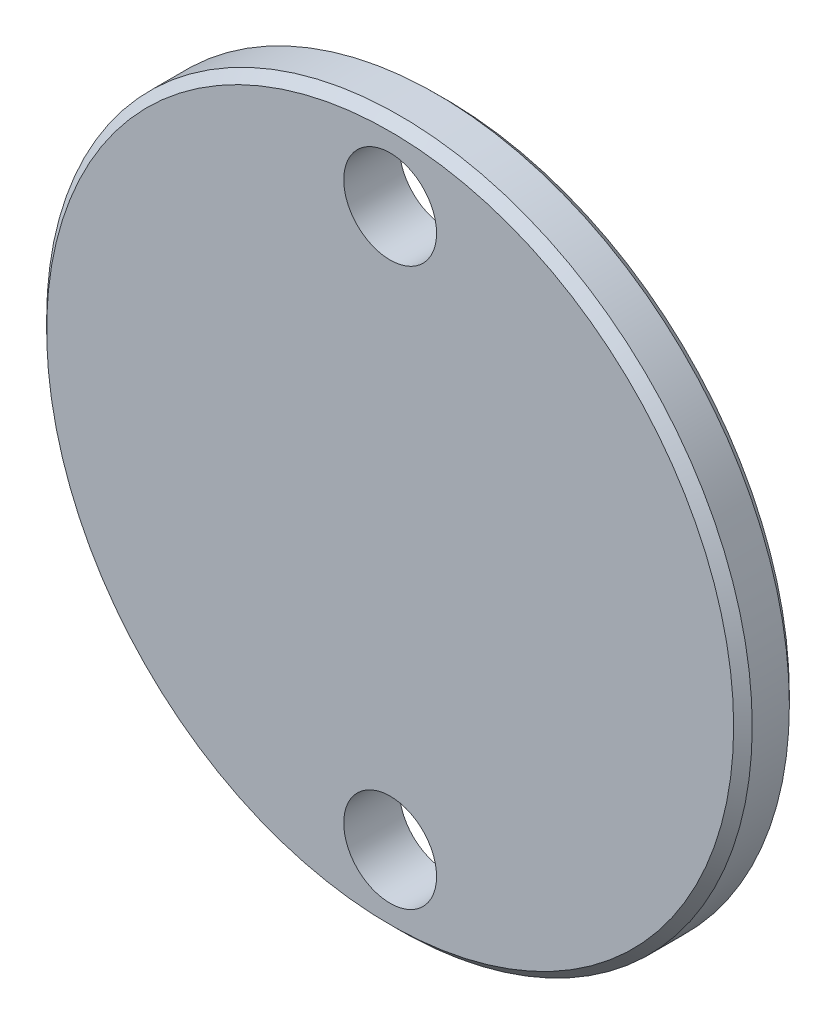
ISO-10303-21;
HEADER;
FILE_DESCRIPTION(('STEP AP214'),'2;1');
FILE_NAME('part.step','',(''),(''),'','','');
FILE_SCHEMA(('AUTOMOTIVE_DESIGN { 1 0 10303 214 1 1 1 1 }'));
ENDSEC;
DATA;
#1=APPLICATION_CONTEXT('core data for automotive mechanical design processes');
#2=APPLICATION_PROTOCOL_DEFINITION('international standard','automotive_design',2000,#1);
#3=PRODUCT_CONTEXT('',#1,'mechanical');
#4=PRODUCT('Part','Part','',(#3));
#5=PRODUCT_RELATED_PRODUCT_CATEGORY('part','',(#4));
#6=PRODUCT_DEFINITION_FORMATION('','',#4);
#7=PRODUCT_DEFINITION_CONTEXT('part definition',#1,'design');
#8=PRODUCT_DEFINITION('design','',#6,#7);
#9=PRODUCT_DEFINITION_SHAPE('','',#8);
#10=(LENGTH_UNIT() NAMED_UNIT(*) SI_UNIT(.MILLI.,.METRE.));
#11=(NAMED_UNIT(*) PLANE_ANGLE_UNIT() SI_UNIT($,.RADIAN.));
#12=(NAMED_UNIT(*) SI_UNIT($,.STERADIAN.) SOLID_ANGLE_UNIT());
#13=UNCERTAINTY_MEASURE_WITH_UNIT(LENGTH_MEASURE(1.E-05),#10,'distance_accuracy_value','');
#14=(GEOMETRIC_REPRESENTATION_CONTEXT(3) GLOBAL_UNCERTAINTY_ASSIGNED_CONTEXT((#13)) GLOBAL_UNIT_ASSIGNED_CONTEXT((#10,
#11,#12)) REPRESENTATION_CONTEXT('',''));
#15=CARTESIAN_POINT('',(0.,0.,0.));
#16=DIRECTION('',(0.,0.,1.));
#17=DIRECTION('',(1.,0.,0.));
#18=AXIS2_PLACEMENT_3D('',#15,#16,#17);
#19=CARTESIAN_POINT('',(0.,0.,3.));
#20=DIRECTION('',(0.,0.,-1.));
#21=DIRECTION('',(-1.,0.,0.));
#22=AXIS2_PLACEMENT_3D('',#19,#20,#21);
#23=CYLINDRICAL_SURFACE('',#22,19.);
#24=CARTESIAN_POINT('',(0.,0.,0.499999999999997));
#25=DIRECTION('',(0.,0.,1.));
#26=DIRECTION('',(1.,0.,0.));
#27=AXIS2_PLACEMENT_3D('',#24,#25,#26);
#28=CIRCLE('',#27,19.);
#29=CARTESIAN_POINT('',(19.,0.,0.499999999999997));
#30=VERTEX_POINT('',#29);
#31=EDGE_CURVE('E39',#30,#30,#28,.T.);
#32=ORIENTED_EDGE('',*,*,#31,.T.);
#33=EDGE_LOOP('',(#32));
#34=FACE_BOUND('',#33,.T.);
#35=CARTESIAN_POINT('',(0.,0.,2.49999999999999));
#36=DIRECTION('',(0.,0.,1.));
#37=DIRECTION('',(1.,0.,0.));
#38=AXIS2_PLACEMENT_3D('',#35,#36,#37);
#39=CIRCLE('',#38,19.);
#40=CARTESIAN_POINT('',(19.,0.,2.49999999999999));
#41=VERTEX_POINT('',#40);
#42=EDGE_CURVE('E43',#41,#41,#39,.F.);
#43=ORIENTED_EDGE('',*,*,#42,.T.);
#44=EDGE_LOOP('',(#43));
#45=FACE_BOUND('',#44,.T.);
#46=ADVANCED_FACE('F28',(#34,#45),#23,.T.);
#47=CARTESIAN_POINT('',(0.,0.,3.));
#48=DIRECTION('',(0.,0.,1.));
#49=DIRECTION('',(1.,0.,0.));
#50=AXIS2_PLACEMENT_3D('',#47,#48,#49);
#51=PLANE('',#50);
#52=CARTESIAN_POINT('',(0.,0.,3.));
#53=DIRECTION('',(0.,0.,1.));
#54=DIRECTION('',(1.,0.,0.));
#55=AXIS2_PLACEMENT_3D('',#52,#53,#54);
#56=CIRCLE('',#55,18.5);
#57=CARTESIAN_POINT('',(18.5,0.,3.));
#58=VERTEX_POINT('',#57);
#59=EDGE_CURVE('E10',#58,#58,#56,.T.);
#60=ORIENTED_EDGE('',*,*,#59,.T.);
#61=EDGE_LOOP('',(#60));
#62=FACE_BOUND('',#61,.T.);
#63=CARTESIAN_POINT('',(4.22651822394593E-13,-15.,3.));
#64=DIRECTION('',(0.,0.,1.));
#65=DIRECTION('',(1.,0.,0.));
#66=AXIS2_PLACEMENT_3D('',#63,#64,#65);
#67=CIRCLE('',#66,2.5000000000005);
#68=CARTESIAN_POINT('',(2.50000000000093,-15.,3.));
#69=VERTEX_POINT('',#68);
#70=EDGE_CURVE('E53',#69,#69,#67,.T.);
#71=ORIENTED_EDGE('',*,*,#70,.F.);
#72=EDGE_LOOP('',(#71));
#73=FACE_BOUND('',#72,.T.);
#74=CARTESIAN_POINT('',(0.,15.,3.));
#75=DIRECTION('',(0.,0.,1.));
#76=DIRECTION('',(1.,0.,0.));
#77=AXIS2_PLACEMENT_3D('',#74,#75,#76);
#78=CIRCLE('',#77,2.5);
#79=CARTESIAN_POINT('',(2.5,15.,3.));
#80=VERTEX_POINT('',#79);
#81=EDGE_CURVE('E52',#80,#80,#78,.T.);
#82=ORIENTED_EDGE('',*,*,#81,.F.);
#83=EDGE_LOOP('',(#82));
#84=FACE_BOUND('',#83,.T.);
#85=ADVANCED_FACE('F64',(#62,#73,#84),#51,.T.);
#86=CARTESIAN_POINT('',(0.,0.,0.));
#87=DIRECTION('',(0.,0.,1.));
#88=DIRECTION('',(1.,0.,0.));
#89=AXIS2_PLACEMENT_3D('',#86,#87,#88);
#90=PLANE('',#89);
#91=CARTESIAN_POINT('',(0.,0.,0.));
#92=DIRECTION('',(0.,0.,1.));
#93=DIRECTION('',(1.,0.,0.));
#94=AXIS2_PLACEMENT_3D('',#91,#92,#93);
#95=CIRCLE('',#94,18.5);
#96=CARTESIAN_POINT('',(18.5,0.,0.));
#97=VERTEX_POINT('',#96);
#98=EDGE_CURVE('E35',#97,#97,#95,.F.);
#99=ORIENTED_EDGE('',*,*,#98,.T.);
#100=EDGE_LOOP('',(#99));
#101=FACE_BOUND('',#100,.T.);
#102=CARTESIAN_POINT('',(4.22651822394593E-13,-15.,0.));
#103=DIRECTION('',(0.,0.,1.));
#104=DIRECTION('',(1.,0.,0.));
#105=AXIS2_PLACEMENT_3D('',#102,#103,#104);
#106=CIRCLE('',#105,2.5000000000005);
#107=CARTESIAN_POINT('',(2.50000000000093,-15.,0.));
#108=VERTEX_POINT('',#107);
#109=EDGE_CURVE('E49',#108,#108,#106,.T.);
#110=ORIENTED_EDGE('',*,*,#109,.T.);
#111=EDGE_LOOP('',(#110));
#112=FACE_BOUND('',#111,.T.);
#113=CARTESIAN_POINT('',(0.,15.,0.));
#114=DIRECTION('',(0.,0.,1.));
#115=DIRECTION('',(1.,0.,0.));
#116=AXIS2_PLACEMENT_3D('',#113,#114,#115);
#117=CIRCLE('',#116,2.5);
#118=CARTESIAN_POINT('',(2.5,15.,0.));
#119=VERTEX_POINT('',#118);
#120=EDGE_CURVE('E48',#119,#119,#117,.T.);
#121=ORIENTED_EDGE('',*,*,#120,.T.);
#122=EDGE_LOOP('',(#121));
#123=FACE_BOUND('',#122,.T.);
#124=ADVANCED_FACE('F67',(#101,#112,#123),#90,.F.);
#125=CARTESIAN_POINT('',(0.,15.,-10.));
#126=DIRECTION('',(0.,0.,1.));
#127=DIRECTION('',(1.,0.,0.));
#128=AXIS2_PLACEMENT_3D('',#125,#126,#127);
#129=CYLINDRICAL_SURFACE('',#128,2.5);
#130=ORIENTED_EDGE('',*,*,#81,.T.);
#131=EDGE_LOOP('',(#130));
#132=FACE_BOUND('',#131,.T.);
#133=ORIENTED_EDGE('',*,*,#120,.F.);
#134=EDGE_LOOP('',(#133));
#135=FACE_BOUND('',#134,.T.);
#136=ADVANCED_FACE('F71',(#132,#135),#129,.F.);
#137=CARTESIAN_POINT('',(4.22651822394593E-13,-15.,-10.));
#138=DIRECTION('',(0.,0.,1.));
#139=DIRECTION('',(1.,0.,0.));
#140=AXIS2_PLACEMENT_3D('',#137,#138,#139);
#141=CYLINDRICAL_SURFACE('',#140,2.5000000000005);
#142=ORIENTED_EDGE('',*,*,#70,.T.);
#143=EDGE_LOOP('',(#142));
#144=FACE_BOUND('',#143,.T.);
#145=ORIENTED_EDGE('',*,*,#109,.F.);
#146=EDGE_LOOP('',(#145));
#147=FACE_BOUND('',#146,.T.);
#148=ADVANCED_FACE('F61',(#144,#147),#141,.F.);
#149=CARTESIAN_POINT('',(0.,0.,0.499999999999997));
#150=DIRECTION('',(0.,0.,1.));
#151=DIRECTION('',(1.,0.,0.));
#152=AXIS2_PLACEMENT_3D('',#149,#150,#151);
#153=CONICAL_SURFACE('',#152,19.,0.785398163397448);
#154=ORIENTED_EDGE('',*,*,#98,.F.);
#155=EDGE_LOOP('',(#154));
#156=FACE_BOUND('',#155,.T.);
#157=ORIENTED_EDGE('',*,*,#31,.F.);
#158=EDGE_LOOP('',(#157));
#159=FACE_BOUND('',#158,.T.);
#160=ADVANCED_FACE('F88',(#156,#159),#153,.T.);
#161=CARTESIAN_POINT('',(0.,0.,3.));
#162=DIRECTION('',(0.,0.,-1.));
#163=DIRECTION('',(-1.,0.,0.));
#164=AXIS2_PLACEMENT_3D('',#161,#162,#163);
#165=CONICAL_SURFACE('',#164,18.5,0.785398163397441);
#166=ORIENTED_EDGE('',*,*,#42,.F.);
#167=EDGE_LOOP('',(#166));
#168=FACE_BOUND('',#167,.T.);
#169=ORIENTED_EDGE('',*,*,#59,.F.);
#170=EDGE_LOOP('',(#169));
#171=FACE_BOUND('',#170,.T.);
#172=ADVANCED_FACE('F30',(#168,#171),#165,.T.);
#173=CLOSED_SHELL('',(#46,#85,#124,#136,#148,#160,#172));
#174=MANIFOLD_SOLID_BREP('B2',#173);
#175=ADVANCED_BREP_SHAPE_REPRESENTATION('',(#18,#174),#14);
#176=SHAPE_DEFINITION_REPRESENTATION(#9,#175);
ENDSEC;
END-ISO-10303-21;
